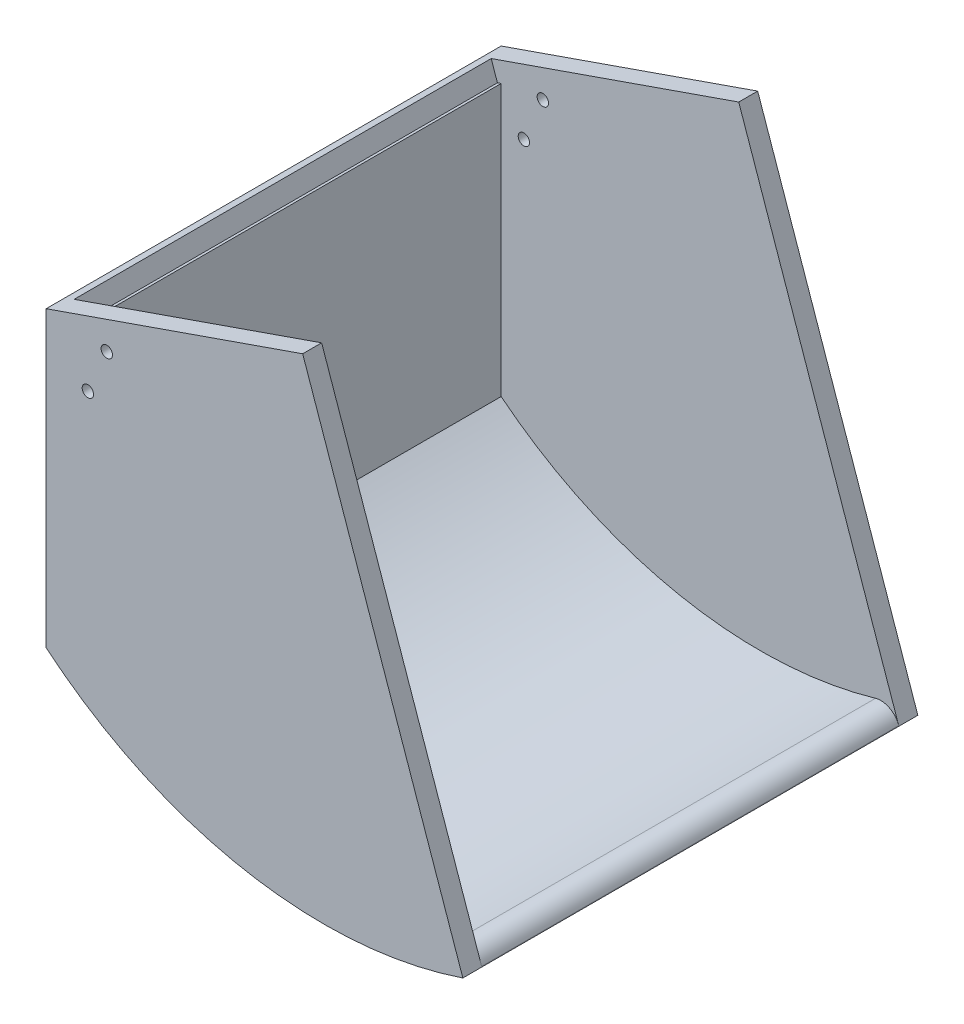
ISO-10303-21;
HEADER;
FILE_DESCRIPTION(('STEP AP214'),'2;1');
FILE_NAME('part.step','',(''),(''),'','','');
FILE_SCHEMA(('AUTOMOTIVE_DESIGN { 1 0 10303 214 1 1 1 1 }'));
ENDSEC;
DATA;
#1=APPLICATION_CONTEXT('core data for automotive mechanical design processes');
#2=APPLICATION_PROTOCOL_DEFINITION('international standard','automotive_design',2000,#1);
#3=PRODUCT_CONTEXT('',#1,'mechanical');
#4=PRODUCT('Part','Part','',(#3));
#5=PRODUCT_RELATED_PRODUCT_CATEGORY('part','',(#4));
#6=PRODUCT_DEFINITION_FORMATION('','',#4);
#7=PRODUCT_DEFINITION_CONTEXT('part definition',#1,'design');
#8=PRODUCT_DEFINITION('design','',#6,#7);
#9=PRODUCT_DEFINITION_SHAPE('','',#8);
#10=(LENGTH_UNIT() NAMED_UNIT(*) SI_UNIT(.MILLI.,.METRE.));
#11=(NAMED_UNIT(*) PLANE_ANGLE_UNIT() SI_UNIT($,.RADIAN.));
#12=(NAMED_UNIT(*) SI_UNIT($,.STERADIAN.) SOLID_ANGLE_UNIT());
#13=UNCERTAINTY_MEASURE_WITH_UNIT(LENGTH_MEASURE(1.E-05),#10,'distance_accuracy_value','');
#14=(GEOMETRIC_REPRESENTATION_CONTEXT(3) GLOBAL_UNCERTAINTY_ASSIGNED_CONTEXT((#13)) GLOBAL_UNIT_ASSIGNED_CONTEXT((#10,
#11,#12)) REPRESENTATION_CONTEXT('',''));
#15=CARTESIAN_POINT('',(0.,0.,0.));
#16=DIRECTION('',(0.,0.,1.));
#17=DIRECTION('',(1.,0.,0.));
#18=AXIS2_PLACEMENT_3D('',#15,#16,#17);
#19=CARTESIAN_POINT('',(100.130587357542,-24.3483526120781,110.));
#20=DIRECTION('',(0.,0.,-1.));
#21=DIRECTION('',(-1.,0.,0.));
#22=AXIS2_PLACEMENT_3D('',#19,#20,#21);
#23=CYLINDRICAL_SURFACE('',#22,5.);
#24=DIRECTION('',(0.,0.,-1.));
#25=VECTOR('',#24,1.);
#26=CARTESIAN_POINT('',(98.7371600747649,-19.5464404504894,110.));
#27=LINE('',#26,#25);
#28=CARTESIAN_POINT('',(98.7371600747649,-19.5464404504894,110.));
#29=VERTEX_POINT('',#28);
#30=CARTESIAN_POINT('',(98.7371600747649,-19.5464404504894,0.));
#31=VERTEX_POINT('',#30);
#32=EDGE_CURVE('E225',#29,#31,#27,.T.);
#33=ORIENTED_EDGE('',*,*,#32,.F.);
#34=CARTESIAN_POINT('',(100.130587357542,-24.3483526120781,110.));
#35=DIRECTION('',(0.,0.,1.));
#36=DIRECTION('',(1.,0.,0.));
#37=AXIS2_PLACEMENT_3D('',#34,#35,#36);
#38=CIRCLE('',#37,5.);
#39=CARTESIAN_POINT('',(104.853071341073,-22.7057494873717,110.));
#40=VERTEX_POINT('',#39);
#41=EDGE_CURVE('E49',#29,#40,#38,.F.);
#42=ORIENTED_EDGE('',*,*,#41,.T.);
#43=DIRECTION('',(0.,0.,1.));
#44=VECTOR('',#43,1.);
#45=CARTESIAN_POINT('',(104.853071341073,-22.7057494873717,110.));
#46=LINE('',#45,#44);
#47=CARTESIAN_POINT('',(104.853071341073,-22.7057494873718,0.));
#48=VERTEX_POINT('',#47);
#49=EDGE_CURVE('E250',#48,#40,#46,.T.);
#50=ORIENTED_EDGE('',*,*,#49,.F.);
#51=CARTESIAN_POINT('',(100.130587357542,-24.3483526120781,0.));
#52=DIRECTION('',(0.,0.,1.));
#53=DIRECTION('',(1.,0.,0.));
#54=AXIS2_PLACEMENT_3D('',#51,#52,#53);
#55=CIRCLE('',#54,5.);
#56=EDGE_CURVE('E11',#48,#31,#55,.T.);
#57=ORIENTED_EDGE('',*,*,#56,.T.);
#58=EDGE_LOOP('',(#33,#42,#50,#57));
#59=FACE_BOUND('',#58,.T.);
#60=ADVANCED_FACE('F41',(#59),#23,.T.);
#61=CARTESIAN_POINT('',(64.3010442773601,93.881328320802,110.));
#62=DIRECTION('',(-0.944496796706159,-0.328520624941273,0.));
#63=DIRECTION('',(0.328520624941273,-0.944496796706159,0.));
#64=AXIS2_PLACEMENT_3D('',#61,#62,#63);
#65=PLANE('',#64);
#66=ORIENTED_EDGE('',*,*,#49,.T.);
#67=DIRECTION('',(-0.328520624941273,0.944496796706159,0.));
#68=VECTOR('',#67,1.);
#69=CARTESIAN_POINT('',(64.3010442773601,93.881328320802,110.));
#70=LINE('',#69,#68);
#71=CARTESIAN_POINT('',(62.6584411526537,98.6038123043329,110.));
#72=VERTEX_POINT('',#71);
#73=EDGE_CURVE('E56',#40,#72,#70,.T.);
#74=ORIENTED_EDGE('',*,*,#73,.T.);
#75=DIRECTION('',(0.,0.,-1.));
#76=VECTOR('',#75,1.);
#77=CARTESIAN_POINT('',(62.6584411526537,98.6038123043328,110.));
#78=LINE('',#77,#76);
#79=CARTESIAN_POINT('',(62.6584411526537,98.6038123043328,115.));
#80=VERTEX_POINT('',#79);
#81=EDGE_CURVE('E226',#80,#72,#78,.T.);
#82=ORIENTED_EDGE('',*,*,#81,.F.);
#83=DIRECTION('',(-0.328520624941273,0.944496796706159,0.));
#84=VECTOR('',#83,1.);
#85=CARTESIAN_POINT('',(64.3010442773601,93.881328320802,115.));
#86=LINE('',#85,#84);
#87=CARTESIAN_POINT('',(104.903109340066,-22.8496087344785,115.));
#88=VERTEX_POINT('',#87);
#89=EDGE_CURVE('E199',#88,#80,#86,.T.);
#90=ORIENTED_EDGE('',*,*,#89,.F.);
#91=DIRECTION('',(0.,0.,-1.));
#92=VECTOR('',#91,1.);
#93=CARTESIAN_POINT('',(104.903109340066,-22.8496087344785,115.));
#94=LINE('',#93,#92);
#95=CARTESIAN_POINT('',(104.903109340066,-22.8496087344785,-5.));
#96=VERTEX_POINT('',#95);
#97=EDGE_CURVE('E221',#88,#96,#94,.T.);
#98=ORIENTED_EDGE('',*,*,#97,.T.);
#99=DIRECTION('',(-0.328520624941273,0.944496796706159,0.));
#100=VECTOR('',#99,1.);
#101=CARTESIAN_POINT('',(64.3010442773601,93.881328320802,-5.));
#102=LINE('',#101,#100);
#103=CARTESIAN_POINT('',(62.6584411526537,98.6038123043328,-5.));
#104=VERTEX_POINT('',#103);
#105=EDGE_CURVE('E194',#96,#104,#102,.T.);
#106=ORIENTED_EDGE('',*,*,#105,.T.);
#107=CARTESIAN_POINT('',(62.6584411526537,98.6038123043329,0.));
#108=VERTEX_POINT('',#107);
#109=EDGE_CURVE('E216',#108,#104,#78,.T.);
#110=ORIENTED_EDGE('',*,*,#109,.F.);
#111=DIRECTION('',(-0.328520624941273,0.944496796706159,0.));
#112=VECTOR('',#111,1.);
#113=CARTESIAN_POINT('',(64.3010442773601,93.881328320802,0.));
#114=LINE('',#113,#112);
#115=EDGE_CURVE('E64',#48,#108,#114,.T.);
#116=ORIENTED_EDGE('',*,*,#115,.F.);
#117=EDGE_LOOP('',(#66,#74,#82,#90,#98,#106,#110,#116));
#118=FACE_BOUND('',#117,.T.);
#119=ADVANCED_FACE('F257',(#118),#65,.F.);
#120=CARTESIAN_POINT('',(68.2395505972083,85.5518618863192,110.));
#121=DIRECTION('',(0.,0.,-1.));
#122=DIRECTION('',(-1.,0.,0.));
#123=AXIS2_PLACEMENT_3D('',#120,#121,#122);
#124=CYLINDRICAL_SURFACE('',#123,114.433803451789);
#125=CARTESIAN_POINT('',(68.2395505972083,85.5518618863192,-5.));
#126=DIRECTION('',(0.,0.,1.));
#127=DIRECTION('',(1.,0.,0.));
#128=AXIS2_PLACEMENT_3D('',#125,#126,#127);
#129=CIRCLE('',#128,114.433803451789);
#130=CARTESIAN_POINT('',(-5.,-2.37460512311797,-5.));
#131=VERTEX_POINT('',#130);
#132=EDGE_CURVE('E190',#131,#96,#129,.T.);
#133=ORIENTED_EDGE('',*,*,#132,.T.);
#134=ORIENTED_EDGE('',*,*,#97,.F.);
#135=CARTESIAN_POINT('',(68.2395505972083,85.5518618863192,115.));
#136=DIRECTION('',(0.,0.,1.));
#137=DIRECTION('',(1.,0.,0.));
#138=AXIS2_PLACEMENT_3D('',#135,#136,#137);
#139=CIRCLE('',#138,114.433803451789);
#140=CARTESIAN_POINT('',(-5.,-2.37460512311797,115.));
#141=VERTEX_POINT('',#140);
#142=EDGE_CURVE('E195',#141,#88,#139,.T.);
#143=ORIENTED_EDGE('',*,*,#142,.F.);
#144=DIRECTION('',(0.,0.,-1.));
#145=VECTOR('',#144,1.);
#146=CARTESIAN_POINT('',(-5.,-2.37460512311797,115.));
#147=LINE('',#146,#145);
#148=EDGE_CURVE('E201',#141,#131,#147,.T.);
#149=ORIENTED_EDGE('',*,*,#148,.T.);
#150=EDGE_LOOP('',(#133,#134,#143,#149));
#151=FACE_BOUND('',#150,.T.);
#152=ADVANCED_FACE('F274',(#151),#124,.T.);
#153=CARTESIAN_POINT('',(-1.64260312470636,76.2382316861206,110.));
#154=DIRECTION('',(0.328520624941273,-0.944496796706159,0.));
#155=DIRECTION('',(0.944496796706159,0.328520624941273,0.));
#156=AXIS2_PLACEMENT_3D('',#153,#154,#155);
#157=PLANE('',#156);
#158=DIRECTION('',(0.,0.,1.));
#159=VECTOR('',#158,1.);
#160=CARTESIAN_POINT('',(-2.62294932641038,75.8972417029193,0.));
#161=LINE('',#160,#159);
#162=CARTESIAN_POINT('',(-2.62294932641038,75.8972417029193,0.));
#163=VERTEX_POINT('',#162);
#164=CARTESIAN_POINT('',(-2.62294932641039,75.8972417029193,110.));
#165=VERTEX_POINT('',#164);
#166=EDGE_CURVE('E159',#163,#165,#161,.T.);
#167=ORIENTED_EDGE('',*,*,#166,.F.);
#168=DIRECTION('',(-0.944496796706159,-0.328520624941273,0.));
#169=VECTOR('',#168,1.);
#170=CARTESIAN_POINT('',(62.6584411526537,98.6038123043329,0.));
#171=LINE('',#170,#169);
#172=EDGE_CURVE('E141',#108,#163,#171,.T.);
#173=ORIENTED_EDGE('',*,*,#172,.F.);
#174=ORIENTED_EDGE('',*,*,#109,.T.);
#175=DIRECTION('',(-0.944496796706159,-0.328520624941273,0.));
#176=VECTOR('',#175,1.);
#177=CARTESIAN_POINT('',(-1.64260312470636,76.2382316861206,-5.));
#178=LINE('',#177,#176);
#179=CARTESIAN_POINT('',(-5.,75.0704414686272,-5.));
#180=VERTEX_POINT('',#179);
#181=EDGE_CURVE('E209',#104,#180,#178,.T.);
#182=ORIENTED_EDGE('',*,*,#181,.T.);
#183=DIRECTION('',(0.,0.,-1.));
#184=VECTOR('',#183,1.);
#185=CARTESIAN_POINT('',(-5.,75.0704414686272,110.));
#186=LINE('',#185,#184);
#187=CARTESIAN_POINT('',(-5.,75.0704414686272,115.));
#188=VERTEX_POINT('',#187);
#189=EDGE_CURVE('E205',#188,#180,#186,.T.);
#190=ORIENTED_EDGE('',*,*,#189,.F.);
#191=DIRECTION('',(-0.944496796706159,-0.328520624941273,0.));
#192=VECTOR('',#191,1.);
#193=CARTESIAN_POINT('',(-1.64260312470636,76.2382316861206,115.));
#194=LINE('',#193,#192);
#195=EDGE_CURVE('E212',#80,#188,#194,.T.);
#196=ORIENTED_EDGE('',*,*,#195,.F.);
#197=ORIENTED_EDGE('',*,*,#81,.T.);
#198=DIRECTION('',(0.944496796706159,0.328520624941273,0.));
#199=VECTOR('',#198,1.);
#200=CARTESIAN_POINT('',(-2.62294932641039,75.8972417029193,110.));
#201=LINE('',#200,#199);
#202=EDGE_CURVE('E134',#165,#72,#201,.T.);
#203=ORIENTED_EDGE('',*,*,#202,.F.);
#204=EDGE_LOOP('',(#167,#173,#174,#182,#190,#196,#197,#203));
#205=FACE_BOUND('',#204,.T.);
#206=ADVANCED_FACE('F263',(#205),#157,.F.);
#207=CARTESIAN_POINT('',(-5.,0.,110.));
#208=DIRECTION('',(1.,0.,0.));
#209=DIRECTION('',(0.,0.,-1.));
#210=AXIS2_PLACEMENT_3D('',#207,#208,#209);
#211=PLANE('',#210);
#212=DIRECTION('',(0.,-1.,0.));
#213=VECTOR('',#212,1.);
#214=CARTESIAN_POINT('',(-5.,0.,-5.));
#215=LINE('',#214,#213);
#216=EDGE_CURVE('E200',#180,#131,#215,.T.);
#217=ORIENTED_EDGE('',*,*,#216,.T.);
#218=ORIENTED_EDGE('',*,*,#148,.F.);
#219=DIRECTION('',(0.,-1.,0.));
#220=VECTOR('',#219,1.);
#221=CARTESIAN_POINT('',(-5.,0.,115.));
#222=LINE('',#221,#220);
#223=EDGE_CURVE('E206',#188,#141,#222,.T.);
#224=ORIENTED_EDGE('',*,*,#223,.F.);
#225=ORIENTED_EDGE('',*,*,#189,.T.);
#226=EDGE_LOOP('',(#217,#218,#224,#225));
#227=FACE_BOUND('',#226,.T.);
#228=ADVANCED_FACE('F279',(#227),#211,.F.);
#229=CARTESIAN_POINT('',(68.2395505972083,85.5518618863192,115.));
#230=DIRECTION('',(0.,0.,1.));
#231=DIRECTION('',(1.,0.,0.));
#232=AXIS2_PLACEMENT_3D('',#229,#230,#231);
#233=PLANE('',#232);
#234=CARTESIAN_POINT('',(11.,73.2457434450325,115.));
#235=DIRECTION('',(0.,0.,1.));
#236=DIRECTION('',(1.,0.,0.));
#237=AXIS2_PLACEMENT_3D('',#234,#235,#236);
#238=CIRCLE('',#237,1.5);
#239=CARTESIAN_POINT('',(12.5,73.2457434450325,115.));
#240=VERTEX_POINT('',#239);
#241=EDGE_CURVE('E160',#240,#240,#238,.T.);
#242=ORIENTED_EDGE('',*,*,#241,.F.);
#243=EDGE_LOOP('',(#242));
#244=FACE_BOUND('',#243,.T.);
#245=CARTESIAN_POINT('',(6.,61.7326958583207,115.));
#246=DIRECTION('',(0.,0.,1.));
#247=DIRECTION('',(1.,0.,0.));
#248=AXIS2_PLACEMENT_3D('',#245,#246,#247);
#249=CIRCLE('',#248,1.5);
#250=CARTESIAN_POINT('',(7.5,61.7326958583207,115.));
#251=VERTEX_POINT('',#250);
#252=EDGE_CURVE('E246',#251,#251,#249,.T.);
#253=ORIENTED_EDGE('',*,*,#252,.F.);
#254=EDGE_LOOP('',(#253));
#255=FACE_BOUND('',#254,.T.);
#256=ORIENTED_EDGE('',*,*,#142,.T.);
#257=ORIENTED_EDGE('',*,*,#89,.T.);
#258=ORIENTED_EDGE('',*,*,#195,.T.);
#259=ORIENTED_EDGE('',*,*,#223,.T.);
#260=EDGE_LOOP('',(#256,#257,#258,#259));
#261=FACE_BOUND('',#260,.T.);
#262=ADVANCED_FACE('F267',(#244,#255,#261),#233,.T.);
#263=CARTESIAN_POINT('',(68.2395505972083,85.5518618863192,-5.));
#264=DIRECTION('',(0.,0.,1.));
#265=DIRECTION('',(1.,0.,0.));
#266=AXIS2_PLACEMENT_3D('',#263,#264,#265);
#267=PLANE('',#266);
#268=CARTESIAN_POINT('',(11.,73.2457434450325,-5.));
#269=DIRECTION('',(0.,0.,1.));
#270=DIRECTION('',(1.,0.,0.));
#271=AXIS2_PLACEMENT_3D('',#268,#269,#270);
#272=CIRCLE('',#271,1.5);
#273=CARTESIAN_POINT('',(12.5,73.2457434450325,-5.00000000000001));
#274=VERTEX_POINT('',#273);
#275=EDGE_CURVE('E240',#274,#274,#272,.T.);
#276=ORIENTED_EDGE('',*,*,#275,.T.);
#277=EDGE_LOOP('',(#276));
#278=FACE_BOUND('',#277,.T.);
#279=CARTESIAN_POINT('',(6.,61.7326958583207,-5.));
#280=DIRECTION('',(0.,0.,1.));
#281=DIRECTION('',(1.,0.,0.));
#282=AXIS2_PLACEMENT_3D('',#279,#280,#281);
#283=CIRCLE('',#282,1.5);
#284=CARTESIAN_POINT('',(7.5,61.7326958583207,-5.00000000000001));
#285=VERTEX_POINT('',#284);
#286=EDGE_CURVE('E350',#285,#285,#283,.T.);
#287=ORIENTED_EDGE('',*,*,#286,.T.);
#288=EDGE_LOOP('',(#287));
#289=FACE_BOUND('',#288,.T.);
#290=ORIENTED_EDGE('',*,*,#132,.F.);
#291=ORIENTED_EDGE('',*,*,#216,.F.);
#292=ORIENTED_EDGE('',*,*,#181,.F.);
#293=ORIENTED_EDGE('',*,*,#105,.F.);
#294=EDGE_LOOP('',(#290,#291,#292,#293));
#295=FACE_BOUND('',#294,.T.);
#296=ADVANCED_FACE('F277',(#278,#289,#295),#267,.F.);
#297=CARTESIAN_POINT('',(68.2395505972083,85.5518618863192,110.));
#298=DIRECTION('',(0.,0.,-1.));
#299=DIRECTION('',(-1.,0.,0.));
#300=AXIS2_PLACEMENT_3D('',#297,#298,#299);
#301=CYLINDRICAL_SURFACE('',#300,109.433803451789);
#302=CARTESIAN_POINT('',(68.2395505972083,85.5518618863192,110.));
#303=DIRECTION('',(0.,0.,1.));
#304=DIRECTION('',(1.,0.,0.));
#305=AXIS2_PLACEMENT_3D('',#302,#303,#304);
#306=CIRCLE('',#305,109.433803451789);
#307=CARTESIAN_POINT('',(0.,0.,110.));
#308=VERTEX_POINT('',#307);
#309=EDGE_CURVE('E168',#308,#29,#306,.T.);
#310=ORIENTED_EDGE('',*,*,#309,.T.);
#311=ORIENTED_EDGE('',*,*,#32,.T.);
#312=CARTESIAN_POINT('',(68.2395505972083,85.5518618863192,0.));
#313=DIRECTION('',(0.,0.,1.));
#314=DIRECTION('',(1.,0.,0.));
#315=AXIS2_PLACEMENT_3D('',#312,#313,#314);
#316=CIRCLE('',#315,109.433803451789);
#317=CARTESIAN_POINT('',(0.,0.,0.));
#318=VERTEX_POINT('',#317);
#319=EDGE_CURVE('E166',#318,#31,#316,.T.);
#320=ORIENTED_EDGE('',*,*,#319,.F.);
#321=DIRECTION('',(0.,0.,-1.));
#322=VECTOR('',#321,1.);
#323=CARTESIAN_POINT('',(0.,0.,110.));
#324=LINE('',#323,#322);
#325=EDGE_CURVE('E178',#308,#318,#324,.T.);
#326=ORIENTED_EDGE('',*,*,#325,.F.);
#327=EDGE_LOOP('',(#310,#311,#320,#326));
#328=FACE_BOUND('',#327,.T.);
#329=ADVANCED_FACE('F299',(#328),#301,.F.);
#330=CARTESIAN_POINT('',(0.,0.,110.));
#331=DIRECTION('',(1.,0.,0.));
#332=DIRECTION('',(0.,0.,-1.));
#333=AXIS2_PLACEMENT_3D('',#330,#331,#332);
#334=PLANE('',#333);
#335=DIRECTION('',(0.,-1.,0.));
#336=VECTOR('',#335,1.);
#337=CARTESIAN_POINT('',(0.,0.,0.));
#338=LINE('',#337,#336);
#339=CARTESIAN_POINT('',(0.,71.5157477025898,0.));
#340=VERTEX_POINT('',#339);
#341=EDGE_CURVE('E172',#340,#318,#338,.T.);
#342=ORIENTED_EDGE('',*,*,#341,.F.);
#343=DIRECTION('',(0.,0.,-1.));
#344=VECTOR('',#343,1.);
#345=CARTESIAN_POINT('',(0.,71.5157477025898,110.));
#346=LINE('',#345,#344);
#347=CARTESIAN_POINT('',(0.,71.5157477025899,110.));
#348=VERTEX_POINT('',#347);
#349=EDGE_CURVE('E130',#348,#340,#346,.T.);
#350=ORIENTED_EDGE('',*,*,#349,.F.);
#351=DIRECTION('',(0.,-1.,0.));
#352=VECTOR('',#351,1.);
#353=CARTESIAN_POINT('',(0.,0.,110.));
#354=LINE('',#353,#352);
#355=EDGE_CURVE('E175',#348,#308,#354,.T.);
#356=ORIENTED_EDGE('',*,*,#355,.T.);
#357=ORIENTED_EDGE('',*,*,#325,.T.);
#358=EDGE_LOOP('',(#342,#350,#356,#357));
#359=FACE_BOUND('',#358,.T.);
#360=ADVANCED_FACE('F302',(#359),#334,.T.);
#361=CARTESIAN_POINT('',(68.2395505972083,85.5518618863192,110.));
#362=DIRECTION('',(0.,0.,1.));
#363=DIRECTION('',(1.,0.,0.));
#364=AXIS2_PLACEMENT_3D('',#361,#362,#363);
#365=PLANE('',#364);
#366=CARTESIAN_POINT('',(11.,73.2457434450325,110.));
#367=DIRECTION('',(0.,0.,1.));
#368=DIRECTION('',(1.,0.,0.));
#369=AXIS2_PLACEMENT_3D('',#366,#367,#368);
#370=CIRCLE('',#369,1.5);
#371=CARTESIAN_POINT('',(12.5,73.2457434450325,110.));
#372=VERTEX_POINT('',#371);
#373=EDGE_CURVE('E245',#372,#372,#370,.T.);
#374=ORIENTED_EDGE('',*,*,#373,.T.);
#375=EDGE_LOOP('',(#374));
#376=FACE_BOUND('',#375,.T.);
#377=CARTESIAN_POINT('',(6.,61.7326958583207,110.));
#378=DIRECTION('',(0.,0.,1.));
#379=DIRECTION('',(1.,0.,0.));
#380=AXIS2_PLACEMENT_3D('',#377,#378,#379);
#381=CIRCLE('',#380,1.5);
#382=CARTESIAN_POINT('',(7.5,61.7326958583207,110.));
#383=VERTEX_POINT('',#382);
#384=EDGE_CURVE('E239',#383,#383,#381,.T.);
#385=ORIENTED_EDGE('',*,*,#384,.T.);
#386=EDGE_LOOP('',(#385));
#387=FACE_BOUND('',#386,.T.);
#388=ORIENTED_EDGE('',*,*,#309,.F.);
#389=ORIENTED_EDGE('',*,*,#355,.F.);
#390=DIRECTION('',(0.944496796706159,0.328520624941273,0.));
#391=VECTOR('',#390,1.);
#392=CARTESIAN_POINT('',(-0.980346201704024,71.1747577193885,110.));
#393=LINE('',#392,#391);
#394=CARTESIAN_POINT('',(-0.980346201704024,71.1747577193885,110.));
#395=VERTEX_POINT('',#394);
#396=EDGE_CURVE('E147',#395,#348,#393,.T.);
#397=ORIENTED_EDGE('',*,*,#396,.F.);
#398=DIRECTION('',(-0.328520624941273,0.944496796706159,0.));
#399=VECTOR('',#398,1.);
#400=CARTESIAN_POINT('',(-0.980346201704024,71.1747577193885,110.));
#401=LINE('',#400,#399);
#402=EDGE_CURVE('E146',#395,#165,#401,.T.);
#403=ORIENTED_EDGE('',*,*,#402,.T.);
#404=ORIENTED_EDGE('',*,*,#202,.T.);
#405=ORIENTED_EDGE('',*,*,#73,.F.);
#406=ORIENTED_EDGE('',*,*,#41,.F.);
#407=EDGE_LOOP('',(#388,#389,#397,#403,#404,#405,#406));
#408=FACE_BOUND('',#407,.T.);
#409=ADVANCED_FACE('F261',(#376,#387,#408),#365,.F.);
#410=CARTESIAN_POINT('',(68.2395505972083,85.5518618863192,0.));
#411=DIRECTION('',(0.,0.,1.));
#412=DIRECTION('',(1.,0.,0.));
#413=AXIS2_PLACEMENT_3D('',#410,#411,#412);
#414=PLANE('',#413);
#415=CARTESIAN_POINT('',(11.,73.2457434450325,0.));
#416=DIRECTION('',(0.,0.,1.));
#417=DIRECTION('',(1.,0.,0.));
#418=AXIS2_PLACEMENT_3D('',#415,#416,#417);
#419=CIRCLE('',#418,1.5);
#420=CARTESIAN_POINT('',(12.5,73.2457434450325,0.));
#421=VERTEX_POINT('',#420);
#422=EDGE_CURVE('E241',#421,#421,#419,.T.);
#423=ORIENTED_EDGE('',*,*,#422,.F.);
#424=EDGE_LOOP('',(#423));
#425=FACE_BOUND('',#424,.T.);
#426=CARTESIAN_POINT('',(6.,61.7326958583207,0.));
#427=DIRECTION('',(0.,0.,1.));
#428=DIRECTION('',(1.,0.,0.));
#429=AXIS2_PLACEMENT_3D('',#426,#427,#428);
#430=CIRCLE('',#429,1.5);
#431=CARTESIAN_POINT('',(7.5,61.7326958583207,0.));
#432=VERTEX_POINT('',#431);
#433=EDGE_CURVE('E235',#432,#432,#430,.T.);
#434=ORIENTED_EDGE('',*,*,#433,.F.);
#435=EDGE_LOOP('',(#434));
#436=FACE_BOUND('',#435,.T.);
#437=ORIENTED_EDGE('',*,*,#319,.T.);
#438=ORIENTED_EDGE('',*,*,#56,.F.);
#439=ORIENTED_EDGE('',*,*,#115,.T.);
#440=ORIENTED_EDGE('',*,*,#172,.T.);
#441=DIRECTION('',(-0.328520624941273,0.944496796706159,0.));
#442=VECTOR('',#441,1.);
#443=CARTESIAN_POINT('',(-0.980346201704021,71.1747577193885,0.));
#444=LINE('',#443,#442);
#445=CARTESIAN_POINT('',(-0.980346201704021,71.1747577193885,0.));
#446=VERTEX_POINT('',#445);
#447=EDGE_CURVE('E137',#446,#163,#444,.T.);
#448=ORIENTED_EDGE('',*,*,#447,.F.);
#449=DIRECTION('',(-0.944496796706159,-0.328520624941273,0.));
#450=VECTOR('',#449,1.);
#451=CARTESIAN_POINT('',(64.3010442773601,93.8813283208021,0.));
#452=LINE('',#451,#450);
#453=EDGE_CURVE('E124',#340,#446,#452,.T.);
#454=ORIENTED_EDGE('',*,*,#453,.F.);
#455=ORIENTED_EDGE('',*,*,#341,.T.);
#456=EDGE_LOOP('',(#437,#438,#439,#440,#448,#454,#455));
#457=FACE_BOUND('',#456,.T.);
#458=ADVANCED_FACE('F139',(#425,#436,#457),#414,.T.);
#459=CARTESIAN_POINT('',(-0.980346201704021,71.1747577193885,0.));
#460=DIRECTION('',(-0.944496796706159,-0.328520624941273,0.));
#461=DIRECTION('',(0.328520624941273,-0.944496796706159,0.));
#462=AXIS2_PLACEMENT_3D('',#459,#460,#461);
#463=PLANE('',#462);
#464=ORIENTED_EDGE('',*,*,#166,.T.);
#465=ORIENTED_EDGE('',*,*,#402,.F.);
#466=DIRECTION('',(0.,0.,1.));
#467=VECTOR('',#466,1.);
#468=CARTESIAN_POINT('',(-0.980346201704021,71.1747577193885,0.));
#469=LINE('',#468,#467);
#470=EDGE_CURVE('E128',#446,#395,#469,.T.);
#471=ORIENTED_EDGE('',*,*,#470,.F.);
#472=ORIENTED_EDGE('',*,*,#447,.T.);
#473=EDGE_LOOP('',(#464,#465,#471,#472));
#474=FACE_BOUND('',#473,.T.);
#475=ADVANCED_FACE('F149',(#474),#463,.F.);
#476=CARTESIAN_POINT('',(-22.1903837728103,63.7973533468297,0.));
#477=DIRECTION('',(-0.328520624941273,0.944496796706159,0.));
#478=DIRECTION('',(-0.944496796706159,-0.328520624941273,0.));
#479=AXIS2_PLACEMENT_3D('',#476,#477,#478);
#480=PLANE('',#479);
#481=ORIENTED_EDGE('',*,*,#453,.T.);
#482=ORIENTED_EDGE('',*,*,#470,.T.);
#483=ORIENTED_EDGE('',*,*,#396,.T.);
#484=ORIENTED_EDGE('',*,*,#349,.T.);
#485=EDGE_LOOP('',(#481,#482,#483,#484));
#486=FACE_BOUND('',#485,.T.);
#487=ADVANCED_FACE('F126',(#486),#480,.T.);
#488=CARTESIAN_POINT('',(6.,61.7326958583207,-5.));
#489=DIRECTION('',(0.,0.,1.));
#490=DIRECTION('',(1.,0.,0.));
#491=AXIS2_PLACEMENT_3D('',#488,#489,#490);
#492=CYLINDRICAL_SURFACE('',#491,1.5);
#493=CARTESIAN_POINT('',(7.5,61.7326958583207,0.));
#494=CARTESIAN_POINT('',(7.5,61.7326958583207,-0.0520833333333342));
#495=CARTESIAN_POINT('',(7.5,61.7326958583207,-0.104166666666668));
#496=CARTESIAN_POINT('',(7.5,61.7326958583207,-0.208333333333334));
#497=CARTESIAN_POINT('',(7.5,61.7326958583207,-0.260416666666668));
#498=CARTESIAN_POINT('',(7.5,61.7326958583207,-0.364583333333334));
#499=CARTESIAN_POINT('',(7.5,61.7326958583207,-0.416666666666668));
#500=CARTESIAN_POINT('',(7.5,61.7326958583207,-0.520833333333335));
#501=CARTESIAN_POINT('',(7.5,61.7326958583207,-0.572916666666668));
#502=CARTESIAN_POINT('',(7.5,61.7326958583207,-0.677083333333335));
#503=CARTESIAN_POINT('',(7.5,61.7326958583207,-0.729166666666668));
#504=CARTESIAN_POINT('',(7.5,61.7326958583207,-0.833333333333335));
#505=CARTESIAN_POINT('',(7.5,61.7326958583207,-0.885416666666668));
#506=CARTESIAN_POINT('',(7.5,61.7326958583207,-0.989583333333335));
#507=CARTESIAN_POINT('',(7.5,61.7326958583207,-1.04166666666667));
#508=CARTESIAN_POINT('',(7.5,61.7326958583207,-1.14583333333334));
#509=CARTESIAN_POINT('',(7.5,61.7326958583207,-1.19791666666667));
#510=CARTESIAN_POINT('',(7.5,61.7326958583207,-1.30208333333334));
#511=CARTESIAN_POINT('',(7.5,61.7326958583207,-1.35416666666667));
#512=CARTESIAN_POINT('',(7.5,61.7326958583207,-1.45833333333334));
#513=CARTESIAN_POINT('',(7.5,61.7326958583207,-1.51041666666667));
#514=CARTESIAN_POINT('',(7.5,61.7326958583207,-1.61458333333334));
#515=CARTESIAN_POINT('',(7.5,61.7326958583207,-1.66666666666667));
#516=CARTESIAN_POINT('',(7.5,61.7326958583207,-1.77083333333334));
#517=CARTESIAN_POINT('',(7.5,61.7326958583207,-1.82291666666667));
#518=CARTESIAN_POINT('',(7.5,61.7326958583207,-1.92708333333334));
#519=CARTESIAN_POINT('',(7.5,61.7326958583207,-1.97916666666667));
#520=CARTESIAN_POINT('',(7.5,61.7326958583207,-2.08333333333334));
#521=CARTESIAN_POINT('',(7.5,61.7326958583207,-2.13541666666667));
#522=CARTESIAN_POINT('',(7.5,61.7326958583207,-2.23958333333334));
#523=CARTESIAN_POINT('',(7.5,61.7326958583207,-2.29166666666667));
#524=CARTESIAN_POINT('',(7.5,61.7326958583207,-2.39583333333334));
#525=CARTESIAN_POINT('',(7.5,61.7326958583207,-2.44791666666667));
#526=CARTESIAN_POINT('',(7.5,61.7326958583207,-2.55208333333334));
#527=CARTESIAN_POINT('',(7.5,61.7326958583207,-2.60416666666667));
#528=CARTESIAN_POINT('',(7.5,61.7326958583207,-2.70833333333334));
#529=CARTESIAN_POINT('',(7.5,61.7326958583207,-2.76041666666667));
#530=CARTESIAN_POINT('',(7.5,61.7326958583207,-2.86458333333334));
#531=CARTESIAN_POINT('',(7.5,61.7326958583207,-2.91666666666667));
#532=CARTESIAN_POINT('',(7.5,61.7326958583207,-3.02083333333334));
#533=CARTESIAN_POINT('',(7.5,61.7326958583207,-3.07291666666667));
#534=CARTESIAN_POINT('',(7.5,61.7326958583207,-3.17708333333334));
#535=CARTESIAN_POINT('',(7.5,61.7326958583207,-3.22916666666667));
#536=CARTESIAN_POINT('',(7.5,61.7326958583207,-3.33333333333334));
#537=CARTESIAN_POINT('',(7.5,61.7326958583207,-3.38541666666667));
#538=CARTESIAN_POINT('',(7.5,61.7326958583207,-3.48958333333334));
#539=CARTESIAN_POINT('',(7.5,61.7326958583207,-3.54166666666667));
#540=CARTESIAN_POINT('',(7.5,61.7326958583207,-3.64583333333334));
#541=CARTESIAN_POINT('',(7.5,61.7326958583207,-3.69791666666667));
#542=CARTESIAN_POINT('',(7.5,61.7326958583207,-3.80208333333334));
#543=CARTESIAN_POINT('',(7.5,61.7326958583207,-3.85416666666667));
#544=CARTESIAN_POINT('',(7.5,61.7326958583207,-3.95833333333334));
#545=CARTESIAN_POINT('',(7.5,61.7326958583207,-4.01041666666667));
#546=CARTESIAN_POINT('',(7.5,61.7326958583207,-4.11458333333334));
#547=CARTESIAN_POINT('',(7.5,61.7326958583207,-4.16666666666667));
#548=CARTESIAN_POINT('',(7.5,61.7326958583207,-4.27083333333334));
#549=CARTESIAN_POINT('',(7.5,61.7326958583207,-4.32291666666667));
#550=CARTESIAN_POINT('',(7.5,61.7326958583207,-4.42708333333334));
#551=CARTESIAN_POINT('',(7.5,61.7326958583207,-4.47916666666667));
#552=CARTESIAN_POINT('',(7.5,61.7326958583207,-4.58333333333334));
#553=CARTESIAN_POINT('',(7.5,61.7326958583207,-4.63541666666667));
#554=CARTESIAN_POINT('',(7.5,61.7326958583207,-4.73958333333334));
#555=CARTESIAN_POINT('',(7.5,61.7326958583207,-4.79166666666667));
#556=CARTESIAN_POINT('',(7.5,61.7326958583207,-4.89583333333334));
#557=CARTESIAN_POINT('',(7.5,61.7326958583207,-4.94791666666667));
#558=CARTESIAN_POINT('',(7.5,61.7326958583207,-5.00000000000001));
#559=B_SPLINE_CURVE_WITH_KNOTS('',3,(#493,#494,#495,#496,#497,#498,#499,#500,#501,#502,#503,
#504,#505,#506,#507,#508,#509,#510,#511,#512,#513,#514,#515,#516,#517,#518,#519,#520,#521,#522,
#523,#524,#525,#526,#527,#528,#529,#530,#531,#532,#533,#534,#535,#536,#537,#538,#539,#540,#541,
#542,#543,#544,#545,#546,#547,#548,#549,#550,#551,#552,#553,#554,#555,#556,#557,#558),
.UNSPECIFIED.,.F.,.F.,(4,2,2,2,2,2,2,2,2,2,2,2,2,2,2,2,2,2,2,2,2,2,2,2,2,2,2,2,2,2,2,2,4),(0.,
0.15625,0.3125,0.46875,0.625000000000001,0.781250000000001,0.937500000000001,1.09375,1.25,
1.40625,1.5625,1.71875,1.875,2.03125,2.1875,2.34375,2.5,2.65625,2.8125,2.96875,3.125,3.28125,
3.4375,3.59375,3.75,3.90625,4.0625,4.21875,4.375,4.53125,4.6875,4.84375,5.),.UNSPECIFIED.);
#560=EDGE_CURVE('BSEAM317',#432,#285,#559,.T.);
#561=ORIENTED_EDGE('',*,*,#433,.T.);
#562=ORIENTED_EDGE('',*,*,#286,.F.);
#563=ORIENTED_EDGE('',*,*,#560,.T.);
#564=ORIENTED_EDGE('',*,*,#560,.F.);
#565=EDGE_LOOP('',(#561,#563,#562,#564));
#566=FACE_BOUND('',#565,.T.);
#567=ADVANCED_FACE('F317',(#566),#492,.F.);
#568=CARTESIAN_POINT('',(11.,73.2457434450325,-5.));
#569=DIRECTION('',(0.,0.,1.));
#570=DIRECTION('',(1.,0.,0.));
#571=AXIS2_PLACEMENT_3D('',#568,#569,#570);
#572=CYLINDRICAL_SURFACE('',#571,1.5);
#573=CARTESIAN_POINT('',(12.5,73.2457434450325,0.));
#574=CARTESIAN_POINT('',(12.5,73.2457434450325,-0.0520833333333342));
#575=CARTESIAN_POINT('',(12.5,73.2457434450325,-0.104166666666668));
#576=CARTESIAN_POINT('',(12.5,73.2457434450325,-0.208333333333334));
#577=CARTESIAN_POINT('',(12.5,73.2457434450325,-0.260416666666668));
#578=CARTESIAN_POINT('',(12.5,73.2457434450325,-0.364583333333334));
#579=CARTESIAN_POINT('',(12.5,73.2457434450325,-0.416666666666668));
#580=CARTESIAN_POINT('',(12.5,73.2457434450325,-0.520833333333335));
#581=CARTESIAN_POINT('',(12.5,73.2457434450325,-0.572916666666668));
#582=CARTESIAN_POINT('',(12.5,73.2457434450325,-0.677083333333335));
#583=CARTESIAN_POINT('',(12.5,73.2457434450325,-0.729166666666668));
#584=CARTESIAN_POINT('',(12.5,73.2457434450325,-0.833333333333335));
#585=CARTESIAN_POINT('',(12.5,73.2457434450325,-0.885416666666668));
#586=CARTESIAN_POINT('',(12.5,73.2457434450325,-0.989583333333335));
#587=CARTESIAN_POINT('',(12.5,73.2457434450325,-1.04166666666667));
#588=CARTESIAN_POINT('',(12.5,73.2457434450325,-1.14583333333334));
#589=CARTESIAN_POINT('',(12.5,73.2457434450325,-1.19791666666667));
#590=CARTESIAN_POINT('',(12.5,73.2457434450325,-1.30208333333334));
#591=CARTESIAN_POINT('',(12.5,73.2457434450325,-1.35416666666667));
#592=CARTESIAN_POINT('',(12.5,73.2457434450325,-1.45833333333334));
#593=CARTESIAN_POINT('',(12.5,73.2457434450325,-1.51041666666667));
#594=CARTESIAN_POINT('',(12.5,73.2457434450325,-1.61458333333334));
#595=CARTESIAN_POINT('',(12.5,73.2457434450325,-1.66666666666667));
#596=CARTESIAN_POINT('',(12.5,73.2457434450325,-1.77083333333334));
#597=CARTESIAN_POINT('',(12.5,73.2457434450325,-1.82291666666667));
#598=CARTESIAN_POINT('',(12.5,73.2457434450325,-1.92708333333334));
#599=CARTESIAN_POINT('',(12.5,73.2457434450325,-1.97916666666667));
#600=CARTESIAN_POINT('',(12.5,73.2457434450325,-2.08333333333334));
#601=CARTESIAN_POINT('',(12.5,73.2457434450325,-2.13541666666667));
#602=CARTESIAN_POINT('',(12.5,73.2457434450325,-2.23958333333334));
#603=CARTESIAN_POINT('',(12.5,73.2457434450325,-2.29166666666667));
#604=CARTESIAN_POINT('',(12.5,73.2457434450325,-2.39583333333334));
#605=CARTESIAN_POINT('',(12.5,73.2457434450325,-2.44791666666667));
#606=CARTESIAN_POINT('',(12.5,73.2457434450325,-2.55208333333334));
#607=CARTESIAN_POINT('',(12.5,73.2457434450325,-2.60416666666667));
#608=CARTESIAN_POINT('',(12.5,73.2457434450325,-2.70833333333334));
#609=CARTESIAN_POINT('',(12.5,73.2457434450325,-2.76041666666667));
#610=CARTESIAN_POINT('',(12.5,73.2457434450325,-2.86458333333334));
#611=CARTESIAN_POINT('',(12.5,73.2457434450325,-2.91666666666667));
#612=CARTESIAN_POINT('',(12.5,73.2457434450325,-3.02083333333334));
#613=CARTESIAN_POINT('',(12.5,73.2457434450325,-3.07291666666667));
#614=CARTESIAN_POINT('',(12.5,73.2457434450325,-3.17708333333334));
#615=CARTESIAN_POINT('',(12.5,73.2457434450325,-3.22916666666667));
#616=CARTESIAN_POINT('',(12.5,73.2457434450325,-3.33333333333334));
#617=CARTESIAN_POINT('',(12.5,73.2457434450325,-3.38541666666667));
#618=CARTESIAN_POINT('',(12.5,73.2457434450325,-3.48958333333334));
#619=CARTESIAN_POINT('',(12.5,73.2457434450325,-3.54166666666667));
#620=CARTESIAN_POINT('',(12.5,73.2457434450325,-3.64583333333334));
#621=CARTESIAN_POINT('',(12.5,73.2457434450325,-3.69791666666667));
#622=CARTESIAN_POINT('',(12.5,73.2457434450325,-3.80208333333334));
#623=CARTESIAN_POINT('',(12.5,73.2457434450325,-3.85416666666667));
#624=CARTESIAN_POINT('',(12.5,73.2457434450325,-3.95833333333334));
#625=CARTESIAN_POINT('',(12.5,73.2457434450325,-4.01041666666667));
#626=CARTESIAN_POINT('',(12.5,73.2457434450325,-4.11458333333334));
#627=CARTESIAN_POINT('',(12.5,73.2457434450325,-4.16666666666667));
#628=CARTESIAN_POINT('',(12.5,73.2457434450325,-4.27083333333334));
#629=CARTESIAN_POINT('',(12.5,73.2457434450325,-4.32291666666667));
#630=CARTESIAN_POINT('',(12.5,73.2457434450325,-4.42708333333334));
#631=CARTESIAN_POINT('',(12.5,73.2457434450325,-4.47916666666667));
#632=CARTESIAN_POINT('',(12.5,73.2457434450325,-4.58333333333334));
#633=CARTESIAN_POINT('',(12.5,73.2457434450325,-4.63541666666667));
#634=CARTESIAN_POINT('',(12.5,73.2457434450325,-4.73958333333334));
#635=CARTESIAN_POINT('',(12.5,73.2457434450325,-4.79166666666667));
#636=CARTESIAN_POINT('',(12.5,73.2457434450325,-4.89583333333334));
#637=CARTESIAN_POINT('',(12.5,73.2457434450325,-4.94791666666667));
#638=CARTESIAN_POINT('',(12.5,73.2457434450325,-5.00000000000001));
#639=B_SPLINE_CURVE_WITH_KNOTS('',3,(#573,#574,#575,#576,#577,#578,#579,#580,#581,#582,#583,
#584,#585,#586,#587,#588,#589,#590,#591,#592,#593,#594,#595,#596,#597,#598,#599,#600,#601,#602,
#603,#604,#605,#606,#607,#608,#609,#610,#611,#612,#613,#614,#615,#616,#617,#618,#619,#620,#621,
#622,#623,#624,#625,#626,#627,#628,#629,#630,#631,#632,#633,#634,#635,#636,#637,#638),
.UNSPECIFIED.,.F.,.F.,(4,2,2,2,2,2,2,2,2,2,2,2,2,2,2,2,2,2,2,2,2,2,2,2,2,2,2,2,2,2,2,2,4),(0.,
0.15625,0.3125,0.46875,0.625000000000001,0.781250000000001,0.937500000000001,1.09375,1.25,
1.40625,1.5625,1.71875,1.875,2.03125,2.1875,2.34375,2.5,2.65625,2.8125,2.96875,3.125,3.28125,
3.4375,3.59375,3.75,3.90625,4.0625,4.21875,4.375,4.53125,4.6875,4.84375,5.),.UNSPECIFIED.);
#640=EDGE_CURVE('BSEAM320',#421,#274,#639,.T.);
#641=ORIENTED_EDGE('',*,*,#422,.T.);
#642=ORIENTED_EDGE('',*,*,#275,.F.);
#643=ORIENTED_EDGE('',*,*,#640,.T.);
#644=ORIENTED_EDGE('',*,*,#640,.F.);
#645=EDGE_LOOP('',(#641,#643,#642,#644));
#646=FACE_BOUND('',#645,.T.);
#647=ADVANCED_FACE('F320',(#646),#572,.F.);
#648=CARTESIAN_POINT('',(7.5,61.7326958583207,115.));
#649=CARTESIAN_POINT('',(7.5,61.7326958583207,114.947916666667));
#650=CARTESIAN_POINT('',(7.5,61.7326958583207,114.895833333333));
#651=CARTESIAN_POINT('',(7.5,61.7326958583207,114.791666666667));
#652=CARTESIAN_POINT('',(7.5,61.7326958583207,114.739583333333));
#653=CARTESIAN_POINT('',(7.5,61.7326958583207,114.635416666667));
#654=CARTESIAN_POINT('',(7.5,61.7326958583207,114.583333333333));
#655=CARTESIAN_POINT('',(7.5,61.7326958583207,114.479166666667));
#656=CARTESIAN_POINT('',(7.5,61.7326958583207,114.427083333333));
#657=CARTESIAN_POINT('',(7.5,61.7326958583207,114.322916666667));
#658=CARTESIAN_POINT('',(7.5,61.7326958583207,114.270833333333));
#659=CARTESIAN_POINT('',(7.5,61.7326958583207,114.166666666667));
#660=CARTESIAN_POINT('',(7.5,61.7326958583207,114.114583333333));
#661=CARTESIAN_POINT('',(7.5,61.7326958583207,114.010416666667));
#662=CARTESIAN_POINT('',(7.5,61.7326958583207,113.958333333333));
#663=CARTESIAN_POINT('',(7.5,61.7326958583207,113.854166666667));
#664=CARTESIAN_POINT('',(7.5,61.7326958583207,113.802083333333));
#665=CARTESIAN_POINT('',(7.5,61.7326958583207,113.697916666667));
#666=CARTESIAN_POINT('',(7.5,61.7326958583207,113.645833333333));
#667=CARTESIAN_POINT('',(7.5,61.7326958583207,113.541666666667));
#668=CARTESIAN_POINT('',(7.5,61.7326958583207,113.489583333333));
#669=CARTESIAN_POINT('',(7.5,61.7326958583207,113.385416666667));
#670=CARTESIAN_POINT('',(7.5,61.7326958583207,113.333333333333));
#671=CARTESIAN_POINT('',(7.5,61.7326958583207,113.229166666667));
#672=CARTESIAN_POINT('',(7.5,61.7326958583207,113.177083333333));
#673=CARTESIAN_POINT('',(7.5,61.7326958583207,113.072916666667));
#674=CARTESIAN_POINT('',(7.5,61.7326958583207,113.020833333333));
#675=CARTESIAN_POINT('',(7.5,61.7326958583207,112.916666666667));
#676=CARTESIAN_POINT('',(7.5,61.7326958583207,112.864583333333));
#677=CARTESIAN_POINT('',(7.5,61.7326958583207,112.760416666667));
#678=CARTESIAN_POINT('',(7.5,61.7326958583207,112.708333333333));
#679=CARTESIAN_POINT('',(7.5,61.7326958583207,112.604166666667));
#680=CARTESIAN_POINT('',(7.5,61.7326958583207,112.552083333333));
#681=CARTESIAN_POINT('',(7.5,61.7326958583207,112.447916666667));
#682=CARTESIAN_POINT('',(7.5,61.7326958583207,112.395833333333));
#683=CARTESIAN_POINT('',(7.5,61.7326958583207,112.291666666667));
#684=CARTESIAN_POINT('',(7.5,61.7326958583207,112.239583333333));
#685=CARTESIAN_POINT('',(7.5,61.7326958583207,112.135416666667));
#686=CARTESIAN_POINT('',(7.5,61.7326958583207,112.083333333333));
#687=CARTESIAN_POINT('',(7.5,61.7326958583207,111.979166666667));
#688=CARTESIAN_POINT('',(7.5,61.7326958583207,111.927083333333));
#689=CARTESIAN_POINT('',(7.5,61.7326958583207,111.822916666667));
#690=CARTESIAN_POINT('',(7.5,61.7326958583207,111.770833333333));
#691=CARTESIAN_POINT('',(7.5,61.7326958583207,111.666666666667));
#692=CARTESIAN_POINT('',(7.5,61.7326958583207,111.614583333333));
#693=CARTESIAN_POINT('',(7.5,61.7326958583207,111.510416666667));
#694=CARTESIAN_POINT('',(7.5,61.7326958583207,111.458333333333));
#695=CARTESIAN_POINT('',(7.5,61.7326958583207,111.354166666667));
#696=CARTESIAN_POINT('',(7.5,61.7326958583207,111.302083333333));
#697=CARTESIAN_POINT('',(7.5,61.7326958583207,111.197916666667));
#698=CARTESIAN_POINT('',(7.5,61.7326958583207,111.145833333333));
#699=CARTESIAN_POINT('',(7.5,61.7326958583207,111.041666666667));
#700=CARTESIAN_POINT('',(7.5,61.7326958583207,110.989583333333));
#701=CARTESIAN_POINT('',(7.5,61.7326958583207,110.885416666667));
#702=CARTESIAN_POINT('',(7.5,61.7326958583207,110.833333333333));
#703=CARTESIAN_POINT('',(7.5,61.7326958583207,110.729166666667));
#704=CARTESIAN_POINT('',(7.5,61.7326958583207,110.677083333333));
#705=CARTESIAN_POINT('',(7.5,61.7326958583207,110.572916666667));
#706=CARTESIAN_POINT('',(7.5,61.7326958583207,110.520833333333));
#707=CARTESIAN_POINT('',(7.5,61.7326958583207,110.416666666667));
#708=CARTESIAN_POINT('',(7.5,61.7326958583207,110.364583333333));
#709=CARTESIAN_POINT('',(7.5,61.7326958583207,110.260416666667));
#710=CARTESIAN_POINT('',(7.5,61.7326958583207,110.208333333333));
#711=CARTESIAN_POINT('',(7.5,61.7326958583207,110.104166666667));
#712=CARTESIAN_POINT('',(7.5,61.7326958583207,110.052083333333));
#713=CARTESIAN_POINT('',(7.5,61.7326958583207,110.));
#714=B_SPLINE_CURVE_WITH_KNOTS('',3,(#648,#649,#650,#651,#652,#653,#654,#655,#656,#657,#658,
#659,#660,#661,#662,#663,#664,#665,#666,#667,#668,#669,#670,#671,#672,#673,#674,#675,#676,#677,
#678,#679,#680,#681,#682,#683,#684,#685,#686,#687,#688,#689,#690,#691,#692,#693,#694,#695,#696,
#697,#698,#699,#700,#701,#702,#703,#704,#705,#706,#707,#708,#709,#710,#711,#712,#713),
.UNSPECIFIED.,.F.,.F.,(4,2,2,2,2,2,2,2,2,2,2,2,2,2,2,2,2,2,2,2,2,2,2,2,2,2,2,2,2,2,2,2,4),(0.,
0.156249999999997,0.312499999999993,0.468750000000004,0.625000000000001,0.781249999999997,
0.937500000000008,1.09375,1.25,1.40625,1.56249999999999,1.71875,1.875,2.03125,2.18750000000001,
2.34375000000001,2.5,2.65625,2.8125,2.96875000000001,3.125,3.28125,3.43750000000001,
3.59375000000001,3.75,3.90625,4.0625,4.21875000000001,4.375,4.53125,4.68750000000001,
4.84375000000001,5.),.UNSPECIFIED.);
#715=EDGE_CURVE('BSEAM322',#251,#383,#714,.T.);
#716=ORIENTED_EDGE('',*,*,#252,.T.);
#717=ORIENTED_EDGE('',*,*,#384,.F.);
#718=ORIENTED_EDGE('',*,*,#715,.T.);
#719=ORIENTED_EDGE('',*,*,#715,.F.);
#720=EDGE_LOOP('',(#716,#718,#717,#719));
#721=FACE_BOUND('',#720,.T.);
#722=ADVANCED_FACE('F322',(#721),#492,.F.);
#723=CARTESIAN_POINT('',(12.5,73.2457434450325,115.));
#724=CARTESIAN_POINT('',(12.5,73.2457434450325,114.947916666667));
#725=CARTESIAN_POINT('',(12.5,73.2457434450325,114.895833333333));
#726=CARTESIAN_POINT('',(12.5,73.2457434450325,114.791666666667));
#727=CARTESIAN_POINT('',(12.5,73.2457434450325,114.739583333333));
#728=CARTESIAN_POINT('',(12.5,73.2457434450325,114.635416666667));
#729=CARTESIAN_POINT('',(12.5,73.2457434450325,114.583333333333));
#730=CARTESIAN_POINT('',(12.5,73.2457434450325,114.479166666667));
#731=CARTESIAN_POINT('',(12.5,73.2457434450325,114.427083333333));
#732=CARTESIAN_POINT('',(12.5,73.2457434450325,114.322916666667));
#733=CARTESIAN_POINT('',(12.5,73.2457434450325,114.270833333333));
#734=CARTESIAN_POINT('',(12.5,73.2457434450325,114.166666666667));
#735=CARTESIAN_POINT('',(12.5,73.2457434450325,114.114583333333));
#736=CARTESIAN_POINT('',(12.5,73.2457434450325,114.010416666667));
#737=CARTESIAN_POINT('',(12.5,73.2457434450325,113.958333333333));
#738=CARTESIAN_POINT('',(12.5,73.2457434450325,113.854166666667));
#739=CARTESIAN_POINT('',(12.5,73.2457434450325,113.802083333333));
#740=CARTESIAN_POINT('',(12.5,73.2457434450325,113.697916666667));
#741=CARTESIAN_POINT('',(12.5,73.2457434450325,113.645833333333));
#742=CARTESIAN_POINT('',(12.5,73.2457434450325,113.541666666667));
#743=CARTESIAN_POINT('',(12.5,73.2457434450325,113.489583333333));
#744=CARTESIAN_POINT('',(12.5,73.2457434450325,113.385416666667));
#745=CARTESIAN_POINT('',(12.5,73.2457434450325,113.333333333333));
#746=CARTESIAN_POINT('',(12.5,73.2457434450325,113.229166666667));
#747=CARTESIAN_POINT('',(12.5,73.2457434450325,113.177083333333));
#748=CARTESIAN_POINT('',(12.5,73.2457434450325,113.072916666667));
#749=CARTESIAN_POINT('',(12.5,73.2457434450325,113.020833333333));
#750=CARTESIAN_POINT('',(12.5,73.2457434450325,112.916666666667));
#751=CARTESIAN_POINT('',(12.5,73.2457434450325,112.864583333333));
#752=CARTESIAN_POINT('',(12.5,73.2457434450325,112.760416666667));
#753=CARTESIAN_POINT('',(12.5,73.2457434450325,112.708333333333));
#754=CARTESIAN_POINT('',(12.5,73.2457434450325,112.604166666667));
#755=CARTESIAN_POINT('',(12.5,73.2457434450325,112.552083333333));
#756=CARTESIAN_POINT('',(12.5,73.2457434450325,112.447916666667));
#757=CARTESIAN_POINT('',(12.5,73.2457434450325,112.395833333333));
#758=CARTESIAN_POINT('',(12.5,73.2457434450325,112.291666666667));
#759=CARTESIAN_POINT('',(12.5,73.2457434450325,112.239583333333));
#760=CARTESIAN_POINT('',(12.5,73.2457434450325,112.135416666667));
#761=CARTESIAN_POINT('',(12.5,73.2457434450325,112.083333333333));
#762=CARTESIAN_POINT('',(12.5,73.2457434450325,111.979166666667));
#763=CARTESIAN_POINT('',(12.5,73.2457434450325,111.927083333333));
#764=CARTESIAN_POINT('',(12.5,73.2457434450325,111.822916666667));
#765=CARTESIAN_POINT('',(12.5,73.2457434450325,111.770833333333));
#766=CARTESIAN_POINT('',(12.5,73.2457434450325,111.666666666667));
#767=CARTESIAN_POINT('',(12.5,73.2457434450325,111.614583333333));
#768=CARTESIAN_POINT('',(12.5,73.2457434450325,111.510416666667));
#769=CARTESIAN_POINT('',(12.5,73.2457434450325,111.458333333333));
#770=CARTESIAN_POINT('',(12.5,73.2457434450325,111.354166666667));
#771=CARTESIAN_POINT('',(12.5,73.2457434450325,111.302083333333));
#772=CARTESIAN_POINT('',(12.5,73.2457434450325,111.197916666667));
#773=CARTESIAN_POINT('',(12.5,73.2457434450325,111.145833333333));
#774=CARTESIAN_POINT('',(12.5,73.2457434450325,111.041666666667));
#775=CARTESIAN_POINT('',(12.5,73.2457434450325,110.989583333333));
#776=CARTESIAN_POINT('',(12.5,73.2457434450325,110.885416666667));
#777=CARTESIAN_POINT('',(12.5,73.2457434450325,110.833333333333));
#778=CARTESIAN_POINT('',(12.5,73.2457434450325,110.729166666667));
#779=CARTESIAN_POINT('',(12.5,73.2457434450325,110.677083333333));
#780=CARTESIAN_POINT('',(12.5,73.2457434450325,110.572916666667));
#781=CARTESIAN_POINT('',(12.5,73.2457434450325,110.520833333333));
#782=CARTESIAN_POINT('',(12.5,73.2457434450325,110.416666666667));
#783=CARTESIAN_POINT('',(12.5,73.2457434450325,110.364583333333));
#784=CARTESIAN_POINT('',(12.5,73.2457434450325,110.260416666667));
#785=CARTESIAN_POINT('',(12.5,73.2457434450325,110.208333333333));
#786=CARTESIAN_POINT('',(12.5,73.2457434450325,110.104166666667));
#787=CARTESIAN_POINT('',(12.5,73.2457434450325,110.052083333333));
#788=CARTESIAN_POINT('',(12.5,73.2457434450325,110.));
#789=B_SPLINE_CURVE_WITH_KNOTS('',3,(#723,#724,#725,#726,#727,#728,#729,#730,#731,#732,#733,
#734,#735,#736,#737,#738,#739,#740,#741,#742,#743,#744,#745,#746,#747,#748,#749,#750,#751,#752,
#753,#754,#755,#756,#757,#758,#759,#760,#761,#762,#763,#764,#765,#766,#767,#768,#769,#770,#771,
#772,#773,#774,#775,#776,#777,#778,#779,#780,#781,#782,#783,#784,#785,#786,#787,#788),
.UNSPECIFIED.,.F.,.F.,(4,2,2,2,2,2,2,2,2,2,2,2,2,2,2,2,2,2,2,2,2,2,2,2,2,2,2,2,2,2,2,2,4),(0.,
0.156249999999997,0.312499999999993,0.468750000000004,0.625000000000001,0.781249999999997,
0.937500000000008,1.09375,1.25,1.40625,1.56249999999999,1.71875,1.875,2.03125,2.18750000000001,
2.34375000000001,2.5,2.65625,2.8125,2.96875000000001,3.125,3.28125,3.43750000000001,
3.59375000000001,3.75,3.90625,4.0625,4.21875000000001,4.375,4.53125,4.68750000000001,
4.84375000000001,5.),.UNSPECIFIED.);
#790=EDGE_CURVE('BSEAM325',#240,#372,#789,.T.);
#791=ORIENTED_EDGE('',*,*,#241,.T.);
#792=ORIENTED_EDGE('',*,*,#373,.F.);
#793=ORIENTED_EDGE('',*,*,#790,.T.);
#794=ORIENTED_EDGE('',*,*,#790,.F.);
#795=EDGE_LOOP('',(#791,#793,#792,#794));
#796=FACE_BOUND('',#795,.T.);
#797=ADVANCED_FACE('F325',(#796),#572,.F.);
#798=CLOSED_SHELL('',(#60,#119,#152,#206,#228,#262,#296,#329,#360,#409,#458,#475,#487,#567,#647,
#722,#797));
#799=MANIFOLD_SOLID_BREP('B2',#798);
#800=ADVANCED_BREP_SHAPE_REPRESENTATION('',(#18,#799),#14);
#801=SHAPE_DEFINITION_REPRESENTATION(#9,#800);
ENDSEC;
END-ISO-10303-21;
